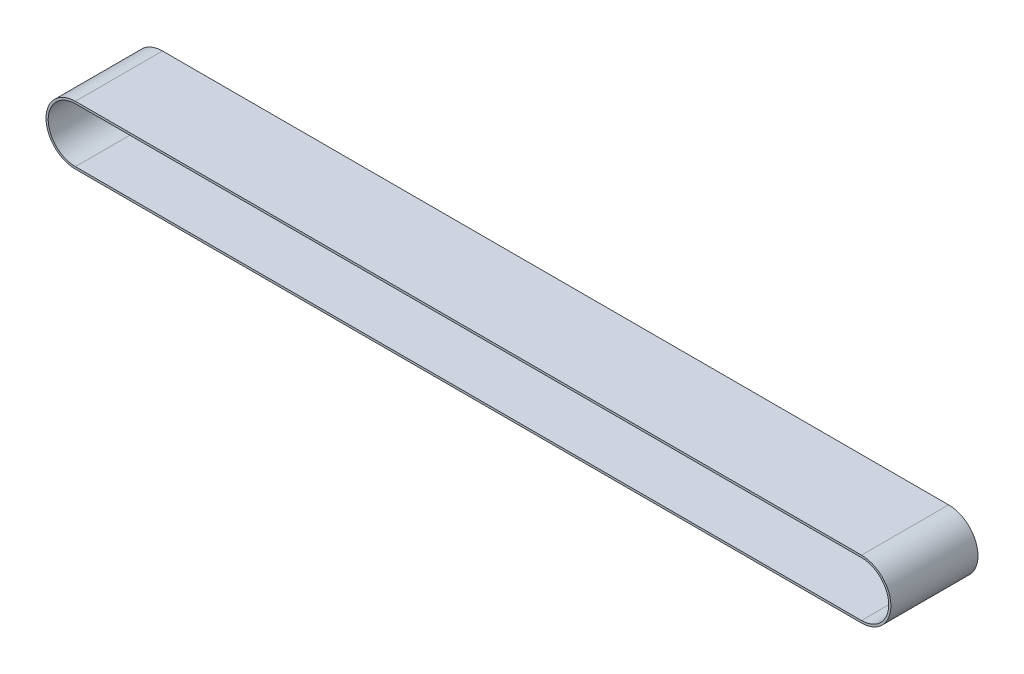
ISO-10303-21;
HEADER;
FILE_DESCRIPTION(('STEP AP214'),'2;1');
FILE_NAME('part.step','',(''),(''),'','','');
FILE_SCHEMA(('AUTOMOTIVE_DESIGN { 1 0 10303 214 1 1 1 1 }'));
ENDSEC;
DATA;
#1=APPLICATION_CONTEXT('core data for automotive mechanical design processes');
#2=APPLICATION_PROTOCOL_DEFINITION('international standard','automotive_design',2000,#1);
#3=PRODUCT_CONTEXT('',#1,'mechanical');
#4=PRODUCT('Part','Part','',(#3));
#5=PRODUCT_RELATED_PRODUCT_CATEGORY('part','',(#4));
#6=PRODUCT_DEFINITION_FORMATION('','',#4);
#7=PRODUCT_DEFINITION_CONTEXT('part definition',#1,'design');
#8=PRODUCT_DEFINITION('design','',#6,#7);
#9=PRODUCT_DEFINITION_SHAPE('','',#8);
#10=(LENGTH_UNIT() NAMED_UNIT(*) SI_UNIT(.MILLI.,.METRE.));
#11=(NAMED_UNIT(*) PLANE_ANGLE_UNIT() SI_UNIT($,.RADIAN.));
#12=(NAMED_UNIT(*) SI_UNIT($,.STERADIAN.) SOLID_ANGLE_UNIT());
#13=UNCERTAINTY_MEASURE_WITH_UNIT(LENGTH_MEASURE(1.E-05),#10,'distance_accuracy_value','');
#14=(GEOMETRIC_REPRESENTATION_CONTEXT(3) GLOBAL_UNCERTAINTY_ASSIGNED_CONTEXT((#13)) GLOBAL_UNIT_ASSIGNED_CONTEXT((#10,
#11,#12)) REPRESENTATION_CONTEXT('',''));
#15=CARTESIAN_POINT('',(0.,0.,0.));
#16=DIRECTION('',(0.,0.,1.));
#17=DIRECTION('',(1.,0.,0.));
#18=AXIS2_PLACEMENT_3D('',#15,#16,#17);
#19=CARTESIAN_POINT('',(345.122813730752,26.8462622942571,80.));
#20=DIRECTION('',(0.,0.,1.));
#21=DIRECTION('',(1.,0.,0.));
#22=AXIS2_PLACEMENT_3D('',#19,#20,#21);
#23=PLANE('',#22);
#24=CARTESIAN_POINT('',(345.122813730752,26.8462622942571,80.));
#25=DIRECTION('',(0.,0.,1.));
#26=DIRECTION('',(1.,0.,0.));
#27=AXIS2_PLACEMENT_3D('',#24,#25,#26);
#28=CIRCLE('',#27,27.0000000000001);
#29=CARTESIAN_POINT('',(345.122813730752,-0.153737705742958,80.));
#30=VERTEX_POINT('',#29);
#31=CARTESIAN_POINT('',(345.122813730752,53.8462622942572,80.));
#32=VERTEX_POINT('',#31);
#33=EDGE_CURVE('E144',#30,#32,#28,.T.);
#34=ORIENTED_EDGE('',*,*,#33,.T.);
#35=DIRECTION('',(-1.,0.,0.));
#36=VECTOR('',#35,1.);
#37=CARTESIAN_POINT('',(345.122813730752,53.8462622942572,80.));
#38=LINE('',#37,#36);
#39=CARTESIAN_POINT('',(-376.877186269248,53.8462622942572,80.));
#40=VERTEX_POINT('',#39);
#41=EDGE_CURVE('E147',#32,#40,#38,.T.);
#42=ORIENTED_EDGE('',*,*,#41,.T.);
#43=CARTESIAN_POINT('',(-376.877186269248,26.8462622942571,80.));
#44=DIRECTION('',(0.,0.,1.));
#45=DIRECTION('',(1.,0.,0.));
#46=AXIS2_PLACEMENT_3D('',#43,#44,#45);
#47=CIRCLE('',#46,27.);
#48=CARTESIAN_POINT('',(-376.877186269248,-0.153737705742965,80.));
#49=VERTEX_POINT('',#48);
#50=EDGE_CURVE('E150',#40,#49,#47,.T.);
#51=ORIENTED_EDGE('',*,*,#50,.T.);
#52=DIRECTION('',(1.,0.,0.));
#53=VECTOR('',#52,1.);
#54=CARTESIAN_POINT('',(345.122813730752,-0.153737705742958,80.));
#55=LINE('',#54,#53);
#56=EDGE_CURVE('E152',#49,#30,#55,.T.);
#57=ORIENTED_EDGE('',*,*,#56,.T.);
#58=EDGE_LOOP('',(#34,#42,#51,#57));
#59=FACE_BOUND('',#58,.T.);
#60=DIRECTION('',(-1.,0.,0.));
#61=VECTOR('',#60,1.);
#62=CARTESIAN_POINT('',(345.122813730752,51.8462622942572,80.));
#63=LINE('',#62,#61);
#64=CARTESIAN_POINT('',(345.122813730752,51.8462622942572,80.));
#65=VERTEX_POINT('',#64);
#66=CARTESIAN_POINT('',(-376.877186269248,51.8462622942571,80.));
#67=VERTEX_POINT('',#66);
#68=EDGE_CURVE('E116',#65,#67,#63,.T.);
#69=ORIENTED_EDGE('',*,*,#68,.F.);
#70=CARTESIAN_POINT('',(345.122813730752,26.8462622942571,80.));
#71=DIRECTION('',(0.,0.,1.));
#72=DIRECTION('',(1.,0.,0.));
#73=AXIS2_PLACEMENT_3D('',#70,#71,#72);
#74=CIRCLE('',#73,25.0000000000001);
#75=CARTESIAN_POINT('',(345.122813730752,1.84626229425704,80.));
#76=VERTEX_POINT('',#75);
#77=EDGE_CURVE('E108',#76,#65,#74,.T.);
#78=ORIENTED_EDGE('',*,*,#77,.F.);
#79=DIRECTION('',(1.,0.,0.));
#80=VECTOR('',#79,1.);
#81=CARTESIAN_POINT('',(345.122813730752,1.84626229425704,80.));
#82=LINE('',#81,#80);
#83=CARTESIAN_POINT('',(-376.877186269248,1.84626229425704,80.));
#84=VERTEX_POINT('',#83);
#85=EDGE_CURVE('E130',#84,#76,#82,.T.);
#86=ORIENTED_EDGE('',*,*,#85,.F.);
#87=CARTESIAN_POINT('',(-376.877186269248,26.8462622942571,80.));
#88=DIRECTION('',(0.,0.,1.));
#89=DIRECTION('',(1.,0.,0.));
#90=AXIS2_PLACEMENT_3D('',#87,#88,#89);
#91=CIRCLE('',#90,25.);
#92=EDGE_CURVE('E128',#67,#84,#91,.T.);
#93=ORIENTED_EDGE('',*,*,#92,.F.);
#94=EDGE_LOOP('',(#69,#78,#86,#93));
#95=FACE_BOUND('',#94,.T.);
#96=ADVANCED_FACE('F43',(#59,#95),#23,.T.);
#97=CARTESIAN_POINT('',(345.122813730752,26.8462622942571,0.));
#98=DIRECTION('',(0.,0.,1.));
#99=DIRECTION('',(1.,0.,0.));
#100=AXIS2_PLACEMENT_3D('',#97,#98,#99);
#101=PLANE('',#100);
#102=CARTESIAN_POINT('',(345.122813730752,26.8462622942571,0.));
#103=DIRECTION('',(0.,0.,1.));
#104=DIRECTION('',(1.,0.,0.));
#105=AXIS2_PLACEMENT_3D('',#102,#103,#104);
#106=CIRCLE('',#105,27.0000000000001);
#107=CARTESIAN_POINT('',(345.122813730752,-0.153737705742958,0.));
#108=VERTEX_POINT('',#107);
#109=CARTESIAN_POINT('',(345.122813730752,53.8462622942572,0.));
#110=VERTEX_POINT('',#109);
#111=EDGE_CURVE('E124',#108,#110,#106,.T.);
#112=ORIENTED_EDGE('',*,*,#111,.F.);
#113=DIRECTION('',(1.,0.,0.));
#114=VECTOR('',#113,1.);
#115=CARTESIAN_POINT('',(345.122813730752,-0.153737705742958,0.));
#116=LINE('',#115,#114);
#117=CARTESIAN_POINT('',(-376.877186269248,-0.153737705742965,0.));
#118=VERTEX_POINT('',#117);
#119=EDGE_CURVE('E148',#118,#108,#116,.T.);
#120=ORIENTED_EDGE('',*,*,#119,.F.);
#121=CARTESIAN_POINT('',(-376.877186269248,26.8462622942571,0.));
#122=DIRECTION('',(0.,0.,1.));
#123=DIRECTION('',(1.,0.,0.));
#124=AXIS2_PLACEMENT_3D('',#121,#122,#123);
#125=CIRCLE('',#124,27.);
#126=CARTESIAN_POINT('',(-376.877186269248,53.8462622942572,0.));
#127=VERTEX_POINT('',#126);
#128=EDGE_CURVE('E159',#127,#118,#125,.T.);
#129=ORIENTED_EDGE('',*,*,#128,.F.);
#130=DIRECTION('',(-1.,0.,0.));
#131=VECTOR('',#130,1.);
#132=CARTESIAN_POINT('',(345.122813730752,53.8462622942572,0.));
#133=LINE('',#132,#131);
#134=EDGE_CURVE('E157',#110,#127,#133,.T.);
#135=ORIENTED_EDGE('',*,*,#134,.F.);
#136=EDGE_LOOP('',(#112,#120,#129,#135));
#137=FACE_BOUND('',#136,.T.);
#138=CARTESIAN_POINT('',(345.122813730752,26.8462622942571,0.));
#139=DIRECTION('',(0.,0.,1.));
#140=DIRECTION('',(1.,0.,0.));
#141=AXIS2_PLACEMENT_3D('',#138,#139,#140);
#142=CIRCLE('',#141,25.0000000000001);
#143=CARTESIAN_POINT('',(345.122813730752,1.84626229425704,0.));
#144=VERTEX_POINT('',#143);
#145=CARTESIAN_POINT('',(345.122813730752,51.8462622942572,0.));
#146=VERTEX_POINT('',#145);
#147=EDGE_CURVE('E66',#144,#146,#142,.T.);
#148=ORIENTED_EDGE('',*,*,#147,.T.);
#149=DIRECTION('',(-1.,0.,0.));
#150=VECTOR('',#149,1.);
#151=CARTESIAN_POINT('',(345.122813730752,51.8462622942572,0.));
#152=LINE('',#151,#150);
#153=CARTESIAN_POINT('',(-376.877186269248,51.8462622942571,0.));
#154=VERTEX_POINT('',#153);
#155=EDGE_CURVE('E123',#146,#154,#152,.T.);
#156=ORIENTED_EDGE('',*,*,#155,.T.);
#157=CARTESIAN_POINT('',(-376.877186269248,26.8462622942571,0.));
#158=DIRECTION('',(0.,0.,1.));
#159=DIRECTION('',(1.,0.,0.));
#160=AXIS2_PLACEMENT_3D('',#157,#158,#159);
#161=CIRCLE('',#160,25.);
#162=CARTESIAN_POINT('',(-376.877186269248,1.84626229425704,0.));
#163=VERTEX_POINT('',#162);
#164=EDGE_CURVE('E136',#154,#163,#161,.T.);
#165=ORIENTED_EDGE('',*,*,#164,.T.);
#166=DIRECTION('',(1.,0.,0.));
#167=VECTOR('',#166,1.);
#168=CARTESIAN_POINT('',(345.122813730752,1.84626229425704,0.));
#169=LINE('',#168,#167);
#170=EDGE_CURVE('E117',#163,#144,#169,.T.);
#171=ORIENTED_EDGE('',*,*,#170,.T.);
#172=EDGE_LOOP('',(#148,#156,#165,#171));
#173=FACE_BOUND('',#172,.T.);
#174=ADVANCED_FACE('F177',(#137,#173),#101,.F.);
#175=CARTESIAN_POINT('',(345.122813730752,26.8462622942571,80.));
#176=DIRECTION('',(0.,0.,-1.));
#177=DIRECTION('',(-1.,0.,0.));
#178=AXIS2_PLACEMENT_3D('',#175,#176,#177);
#179=CYLINDRICAL_SURFACE('',#178,27.0000000000001);
#180=ORIENTED_EDGE('',*,*,#111,.T.);
#181=DIRECTION('',(0.,0.,-1.));
#182=VECTOR('',#181,1.);
#183=CARTESIAN_POINT('',(345.122813730752,53.8462622942572,80.));
#184=LINE('',#183,#182);
#185=EDGE_CURVE('E11',#32,#110,#184,.T.);
#186=ORIENTED_EDGE('',*,*,#185,.F.);
#187=ORIENTED_EDGE('',*,*,#33,.F.);
#188=DIRECTION('',(0.,0.,-1.));
#189=VECTOR('',#188,1.);
#190=CARTESIAN_POINT('',(345.122813730752,-0.153737705742958,80.));
#191=LINE('',#190,#189);
#192=EDGE_CURVE('E154',#30,#108,#191,.T.);
#193=ORIENTED_EDGE('',*,*,#192,.T.);
#194=EDGE_LOOP('',(#180,#186,#187,#193));
#195=FACE_BOUND('',#194,.T.);
#196=ADVANCED_FACE('F45',(#195),#179,.T.);
#197=CARTESIAN_POINT('',(345.122813730752,53.8462622942572,80.));
#198=DIRECTION('',(0.,-1.,0.));
#199=DIRECTION('',(1.,0.,0.));
#200=AXIS2_PLACEMENT_3D('',#197,#198,#199);
#201=PLANE('',#200);
#202=ORIENTED_EDGE('',*,*,#134,.T.);
#203=DIRECTION('',(0.,0.,-1.));
#204=VECTOR('',#203,1.);
#205=CARTESIAN_POINT('',(-376.877186269248,53.8462622942572,80.));
#206=LINE('',#205,#204);
#207=EDGE_CURVE('E51',#40,#127,#206,.T.);
#208=ORIENTED_EDGE('',*,*,#207,.F.);
#209=ORIENTED_EDGE('',*,*,#41,.F.);
#210=ORIENTED_EDGE('',*,*,#185,.T.);
#211=EDGE_LOOP('',(#202,#208,#209,#210));
#212=FACE_BOUND('',#211,.T.);
#213=ADVANCED_FACE('F187',(#212),#201,.F.);
#214=CARTESIAN_POINT('',(-376.877186269248,26.8462622942571,80.));
#215=DIRECTION('',(0.,0.,-1.));
#216=DIRECTION('',(-1.,0.,0.));
#217=AXIS2_PLACEMENT_3D('',#214,#215,#216);
#218=CYLINDRICAL_SURFACE('',#217,27.);
#219=ORIENTED_EDGE('',*,*,#128,.T.);
#220=DIRECTION('',(0.,0.,-1.));
#221=VECTOR('',#220,1.);
#222=CARTESIAN_POINT('',(-376.877186269248,-0.153737705742965,80.));
#223=LINE('',#222,#221);
#224=EDGE_CURVE('E164',#49,#118,#223,.T.);
#225=ORIENTED_EDGE('',*,*,#224,.F.);
#226=ORIENTED_EDGE('',*,*,#50,.F.);
#227=ORIENTED_EDGE('',*,*,#207,.T.);
#228=EDGE_LOOP('',(#219,#225,#226,#227));
#229=FACE_BOUND('',#228,.T.);
#230=ADVANCED_FACE('F171',(#229),#218,.T.);
#231=CARTESIAN_POINT('',(345.122813730752,-0.153737705742958,80.));
#232=DIRECTION('',(0.,1.,0.));
#233=DIRECTION('',(-1.,0.,0.));
#234=AXIS2_PLACEMENT_3D('',#231,#232,#233);
#235=PLANE('',#234);
#236=ORIENTED_EDGE('',*,*,#119,.T.);
#237=ORIENTED_EDGE('',*,*,#192,.F.);
#238=ORIENTED_EDGE('',*,*,#56,.F.);
#239=ORIENTED_EDGE('',*,*,#224,.T.);
#240=EDGE_LOOP('',(#236,#237,#238,#239));
#241=FACE_BOUND('',#240,.T.);
#242=ADVANCED_FACE('F181',(#241),#235,.F.);
#243=CARTESIAN_POINT('',(345.122813730752,26.8462622942571,80.));
#244=DIRECTION('',(0.,0.,-1.));
#245=DIRECTION('',(-1.,0.,0.));
#246=AXIS2_PLACEMENT_3D('',#243,#244,#245);
#247=CYLINDRICAL_SURFACE('',#246,25.0000000000001);
#248=ORIENTED_EDGE('',*,*,#147,.F.);
#249=DIRECTION('',(0.,0.,-1.));
#250=VECTOR('',#249,1.);
#251=CARTESIAN_POINT('',(345.122813730752,1.84626229425704,80.));
#252=LINE('',#251,#250);
#253=EDGE_CURVE('E112',#76,#144,#252,.T.);
#254=ORIENTED_EDGE('',*,*,#253,.F.);
#255=ORIENTED_EDGE('',*,*,#77,.T.);
#256=DIRECTION('',(0.,0.,-1.));
#257=VECTOR('',#256,1.);
#258=CARTESIAN_POINT('',(345.122813730752,51.8462622942572,80.));
#259=LINE('',#258,#257);
#260=EDGE_CURVE('E111',#65,#146,#259,.T.);
#261=ORIENTED_EDGE('',*,*,#260,.T.);
#262=EDGE_LOOP('',(#248,#254,#255,#261));
#263=FACE_BOUND('',#262,.T.);
#264=ADVANCED_FACE('F110',(#263),#247,.F.);
#265=CARTESIAN_POINT('',(345.122813730752,51.8462622942572,80.));
#266=DIRECTION('',(0.,-1.,0.));
#267=DIRECTION('',(1.,0.,0.));
#268=AXIS2_PLACEMENT_3D('',#265,#266,#267);
#269=PLANE('',#268);
#270=ORIENTED_EDGE('',*,*,#155,.F.);
#271=ORIENTED_EDGE('',*,*,#260,.F.);
#272=ORIENTED_EDGE('',*,*,#68,.T.);
#273=DIRECTION('',(0.,0.,-1.));
#274=VECTOR('',#273,1.);
#275=CARTESIAN_POINT('',(-376.877186269248,51.8462622942571,80.));
#276=LINE('',#275,#274);
#277=EDGE_CURVE('E125',#67,#154,#276,.T.);
#278=ORIENTED_EDGE('',*,*,#277,.T.);
#279=EDGE_LOOP('',(#270,#271,#272,#278));
#280=FACE_BOUND('',#279,.T.);
#281=ADVANCED_FACE('F120',(#280),#269,.T.);
#282=CARTESIAN_POINT('',(-376.877186269248,26.8462622942571,80.));
#283=DIRECTION('',(0.,0.,-1.));
#284=DIRECTION('',(-1.,0.,0.));
#285=AXIS2_PLACEMENT_3D('',#282,#283,#284);
#286=CYLINDRICAL_SURFACE('',#285,25.);
#287=ORIENTED_EDGE('',*,*,#164,.F.);
#288=ORIENTED_EDGE('',*,*,#277,.F.);
#289=ORIENTED_EDGE('',*,*,#92,.T.);
#290=DIRECTION('',(0.,0.,-1.));
#291=VECTOR('',#290,1.);
#292=CARTESIAN_POINT('',(-376.877186269248,1.84626229425704,80.));
#293=LINE('',#292,#291);
#294=EDGE_CURVE('E58',#84,#163,#293,.T.);
#295=ORIENTED_EDGE('',*,*,#294,.T.);
#296=EDGE_LOOP('',(#287,#288,#289,#295));
#297=FACE_BOUND('',#296,.T.);
#298=ADVANCED_FACE('F210',(#297),#286,.F.);
#299=CARTESIAN_POINT('',(345.122813730752,1.84626229425704,80.));
#300=DIRECTION('',(0.,1.,0.));
#301=DIRECTION('',(-1.,0.,0.));
#302=AXIS2_PLACEMENT_3D('',#299,#300,#301);
#303=PLANE('',#302);
#304=ORIENTED_EDGE('',*,*,#170,.F.);
#305=ORIENTED_EDGE('',*,*,#294,.F.);
#306=ORIENTED_EDGE('',*,*,#85,.T.);
#307=ORIENTED_EDGE('',*,*,#253,.T.);
#308=EDGE_LOOP('',(#304,#305,#306,#307));
#309=FACE_BOUND('',#308,.T.);
#310=ADVANCED_FACE('F214',(#309),#303,.T.);
#311=CLOSED_SHELL('',(#96,#174,#196,#213,#230,#242,#264,#281,#298,#310));
#312=MANIFOLD_SOLID_BREP('B2',#311);
#313=ADVANCED_BREP_SHAPE_REPRESENTATION('',(#18,#312),#14);
#314=SHAPE_DEFINITION_REPRESENTATION(#9,#313);
ENDSEC;
END-ISO-10303-21;
